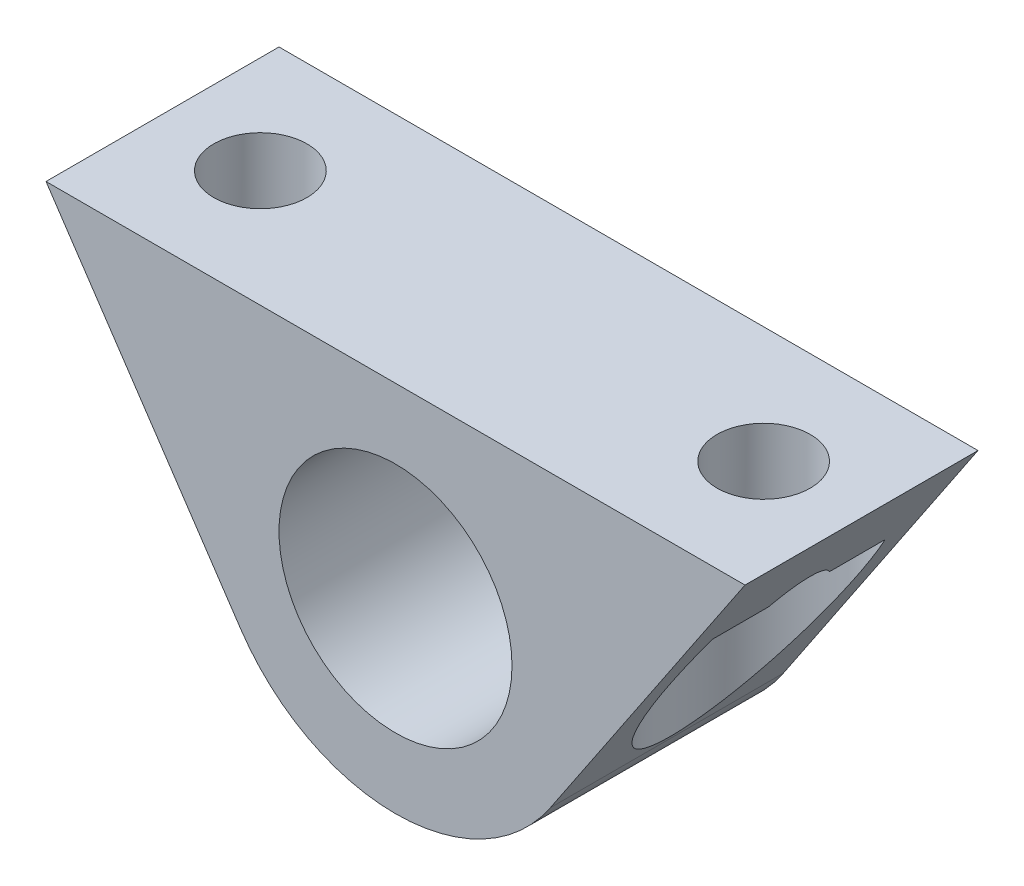
ISO-10303-21;
HEADER;
FILE_DESCRIPTION(('STEP AP214'),'2;1');
FILE_NAME('part.step','',(''),(''),'','','');
FILE_SCHEMA(('AUTOMOTIVE_DESIGN { 1 0 10303 214 1 1 1 1 }'));
ENDSEC;
DATA;
#1=APPLICATION_CONTEXT('core data for automotive mechanical design processes');
#2=APPLICATION_PROTOCOL_DEFINITION('international standard','automotive_design',2000,#1);
#3=PRODUCT_CONTEXT('',#1,'mechanical');
#4=PRODUCT('Part','Part','',(#3));
#5=PRODUCT_RELATED_PRODUCT_CATEGORY('part','',(#4));
#6=PRODUCT_DEFINITION_FORMATION('','',#4);
#7=PRODUCT_DEFINITION_CONTEXT('part definition',#1,'design');
#8=PRODUCT_DEFINITION('design','',#6,#7);
#9=PRODUCT_DEFINITION_SHAPE('','',#8);
#10=(LENGTH_UNIT() NAMED_UNIT(*) SI_UNIT(.MILLI.,.METRE.));
#11=(NAMED_UNIT(*) PLANE_ANGLE_UNIT() SI_UNIT($,.RADIAN.));
#12=(NAMED_UNIT(*) SI_UNIT($,.STERADIAN.) SOLID_ANGLE_UNIT());
#13=UNCERTAINTY_MEASURE_WITH_UNIT(LENGTH_MEASURE(1.E-05),#10,'distance_accuracy_value','');
#14=(GEOMETRIC_REPRESENTATION_CONTEXT(3) GLOBAL_UNCERTAINTY_ASSIGNED_CONTEXT((#13)) GLOBAL_UNIT_ASSIGNED_CONTEXT((#10,
#11,#12)) REPRESENTATION_CONTEXT('',''));
#15=CARTESIAN_POINT('',(0.,0.,0.));
#16=DIRECTION('',(0.,0.,1.));
#17=DIRECTION('',(1.,0.,0.));
#18=AXIS2_PLACEMENT_3D('',#15,#16,#17);
#19=CARTESIAN_POINT('',(0.,0.,5.));
#20=DIRECTION('',(0.,0.,1.));
#21=DIRECTION('',(1.,0.,0.));
#22=AXIS2_PLACEMENT_3D('',#19,#20,#21);
#23=PLANE('',#22);
#24=DIRECTION('',(0.557093425605536,-0.830449826989619,0.));
#25=VECTOR('',#24,1.);
#26=CARTESIAN_POINT('',(-7.5,4.,5.));
#27=LINE('',#26,#25);
#28=CARTESIAN_POINT('',(-7.5,4.,5.));
#29=VERTEX_POINT('',#28);
#30=CARTESIAN_POINT('',(-3.32179930795848,-2.22837370242214,5.));
#31=VERTEX_POINT('',#30);
#32=EDGE_CURVE('E145',#29,#31,#27,.T.);
#33=ORIENTED_EDGE('',*,*,#32,.T.);
#34=CARTESIAN_POINT('',(0.,0.,5.));
#35=DIRECTION('',(0.,0.,1.));
#36=DIRECTION('',(1.,0.,0.));
#37=AXIS2_PLACEMENT_3D('',#34,#35,#36);
#38=CIRCLE('',#37,4.);
#39=CARTESIAN_POINT('',(3.32179930795848,-2.22837370242214,5.));
#40=VERTEX_POINT('',#39);
#41=EDGE_CURVE('E82',#31,#40,#38,.T.);
#42=ORIENTED_EDGE('',*,*,#41,.T.);
#43=DIRECTION('',(0.557093425605536,0.830449826989619,0.));
#44=VECTOR('',#43,1.);
#45=CARTESIAN_POINT('',(7.5,4.,5.));
#46=LINE('',#45,#44);
#47=CARTESIAN_POINT('',(7.5,4.,5.));
#48=VERTEX_POINT('',#47);
#49=EDGE_CURVE('E154',#40,#48,#46,.T.);
#50=ORIENTED_EDGE('',*,*,#49,.T.);
#51=DIRECTION('',(-1.,0.,0.));
#52=VECTOR('',#51,1.);
#53=CARTESIAN_POINT('',(-7.5,4.,5.));
#54=LINE('',#53,#52);
#55=EDGE_CURVE('E50',#48,#29,#54,.T.);
#56=ORIENTED_EDGE('',*,*,#55,.T.);
#57=EDGE_LOOP('',(#33,#42,#50,#56));
#58=FACE_BOUND('',#57,.T.);
#59=CARTESIAN_POINT('',(0.,0.,5.));
#60=DIRECTION('',(0.,0.,1.));
#61=DIRECTION('',(1.,0.,0.));
#62=AXIS2_PLACEMENT_3D('',#59,#60,#61);
#63=CIRCLE('',#62,2.5);
#64=CARTESIAN_POINT('',(2.5,0.,5.));
#65=VERTEX_POINT('',#64);
#66=EDGE_CURVE('E152',#65,#65,#63,.T.);
#67=ORIENTED_EDGE('',*,*,#66,.F.);
#68=EDGE_LOOP('',(#67));
#69=FACE_BOUND('',#68,.T.);
#70=ADVANCED_FACE('F33',(#58,#69),#23,.T.);
#71=CARTESIAN_POINT('',(0.,0.,0.));
#72=DIRECTION('',(0.,0.,1.));
#73=DIRECTION('',(1.,0.,0.));
#74=AXIS2_PLACEMENT_3D('',#71,#72,#73);
#75=PLANE('',#74);
#76=DIRECTION('',(0.557093425605536,-0.830449826989619,0.));
#77=VECTOR('',#76,1.);
#78=CARTESIAN_POINT('',(-7.5,4.,0.));
#79=LINE('',#78,#77);
#80=CARTESIAN_POINT('',(-7.5,4.,0.));
#81=VERTEX_POINT('',#80);
#82=CARTESIAN_POINT('',(-3.32179930795848,-2.22837370242214,0.));
#83=VERTEX_POINT('',#82);
#84=EDGE_CURVE('E149',#81,#83,#79,.T.);
#85=ORIENTED_EDGE('',*,*,#84,.F.);
#86=DIRECTION('',(-1.,0.,0.));
#87=VECTOR('',#86,1.);
#88=CARTESIAN_POINT('',(-7.5,4.,0.));
#89=LINE('',#88,#87);
#90=CARTESIAN_POINT('',(7.5,4.,0.));
#91=VERTEX_POINT('',#90);
#92=EDGE_CURVE('E74',#91,#81,#89,.T.);
#93=ORIENTED_EDGE('',*,*,#92,.F.);
#94=DIRECTION('',(0.557093425605536,0.830449826989619,0.));
#95=VECTOR('',#94,1.);
#96=CARTESIAN_POINT('',(7.5,4.,0.));
#97=LINE('',#96,#95);
#98=CARTESIAN_POINT('',(3.32179930795848,-2.22837370242214,0.));
#99=VERTEX_POINT('',#98);
#100=EDGE_CURVE('E68',#99,#91,#97,.T.);
#101=ORIENTED_EDGE('',*,*,#100,.F.);
#102=CARTESIAN_POINT('',(0.,0.,0.));
#103=DIRECTION('',(0.,0.,1.));
#104=DIRECTION('',(1.,0.,0.));
#105=AXIS2_PLACEMENT_3D('',#102,#103,#104);
#106=CIRCLE('',#105,4.);
#107=EDGE_CURVE('E147',#83,#99,#106,.T.);
#108=ORIENTED_EDGE('',*,*,#107,.F.);
#109=EDGE_LOOP('',(#85,#93,#101,#108));
#110=FACE_BOUND('',#109,.T.);
#111=CARTESIAN_POINT('',(0.,0.,0.));
#112=DIRECTION('',(0.,0.,1.));
#113=DIRECTION('',(1.,0.,0.));
#114=AXIS2_PLACEMENT_3D('',#111,#112,#113);
#115=CIRCLE('',#114,2.5);
#116=CARTESIAN_POINT('',(2.5,0.,0.));
#117=VERTEX_POINT('',#116);
#118=EDGE_CURVE('E158',#117,#117,#115,.T.);
#119=ORIENTED_EDGE('',*,*,#118,.T.);
#120=EDGE_LOOP('',(#119));
#121=FACE_BOUND('',#120,.T.);
#122=ADVANCED_FACE('F209',(#110,#121),#75,.F.);
#123=CARTESIAN_POINT('',(-7.5,4.,5.));
#124=DIRECTION('',(0.830449826989619,0.557093425605536,0.));
#125=DIRECTION('',(-0.557093425605536,0.830449826989619,0.));
#126=AXIS2_PLACEMENT_3D('',#123,#124,#125);
#127=PLANE('',#126);
#128=DIRECTION('',(0.,0.,1.));
#129=VECTOR('',#128,1.);
#130=CARTESIAN_POINT('',(-6.15833333333333,2.,5.));
#131=LINE('',#130,#129);
#132=CARTESIAN_POINT('',(-6.15833333333333,2.,0.649343209680531));
#133=VERTEX_POINT('',#132);
#134=CARTESIAN_POINT('',(-6.15833333333333,2.,1.84813302311318));
#135=VERTEX_POINT('',#134);
#136=EDGE_CURVE('E42',#133,#135,#131,.T.);
#137=ORIENTED_EDGE('',*,*,#136,.T.);
#138=CARTESIAN_POINT('',(-5.4,0.869565217391309,2.5));
#139=DIRECTION('',(0.830449826989619,0.557093425605536,0.));
#140=DIRECTION('',(-0.557093425605536,0.830449826989619,0.));
#141=AXIS2_PLACEMENT_3D('',#138,#139,#140);
#142=ELLIPSE('',#141,1.79503105590062,1.);
#143=CARTESIAN_POINT('',(-6.15833333333333,2.,3.15186697688682));
#144=VERTEX_POINT('',#143);
#145=EDGE_CURVE('E111',#135,#144,#142,.T.);
#146=ORIENTED_EDGE('',*,*,#145,.T.);
#147=CARTESIAN_POINT('',(-6.15833333333333,2.,4.35065679031947));
#148=VERTEX_POINT('',#147);
#149=EDGE_CURVE('E121',#144,#148,#131,.T.);
#150=ORIENTED_EDGE('',*,*,#149,.T.);
#151=CARTESIAN_POINT('',(-5.4,0.869565217391308,2.5));
#152=DIRECTION('',(0.830449826989619,0.557093425605536,0.));
#153=DIRECTION('',(-0.557093425605536,0.830449826989619,0.));
#154=AXIS2_PLACEMENT_3D('',#151,#152,#153);
#155=ELLIPSE('',#154,3.59006211180124,2.);
#156=EDGE_CURVE('E11',#148,#133,#155,.T.);
#157=ORIENTED_EDGE('',*,*,#156,.T.);
#158=EDGE_LOOP('',(#137,#146,#150,#157));
#159=FACE_BOUND('',#158,.T.);
#160=ORIENTED_EDGE('',*,*,#84,.T.);
#161=DIRECTION('',(0.,0.,-1.));
#162=VECTOR('',#161,1.);
#163=CARTESIAN_POINT('',(-3.32179930795848,-2.22837370242214,5.));
#164=LINE('',#163,#162);
#165=EDGE_CURVE('E136',#31,#83,#164,.T.);
#166=ORIENTED_EDGE('',*,*,#165,.F.);
#167=ORIENTED_EDGE('',*,*,#32,.F.);
#168=DIRECTION('',(0.,0.,-1.));
#169=VECTOR('',#168,1.);
#170=CARTESIAN_POINT('',(-7.5,4.,5.));
#171=LINE('',#170,#169);
#172=EDGE_CURVE('E142',#29,#81,#171,.T.);
#173=ORIENTED_EDGE('',*,*,#172,.T.);
#174=EDGE_LOOP('',(#160,#166,#167,#173));
#175=FACE_BOUND('',#174,.T.);
#176=ADVANCED_FACE('F35',(#159,#175),#127,.F.);
#177=CARTESIAN_POINT('',(0.,0.,5.));
#178=DIRECTION('',(0.,0.,-1.));
#179=DIRECTION('',(-1.,0.,0.));
#180=AXIS2_PLACEMENT_3D('',#177,#178,#179);
#181=CYLINDRICAL_SURFACE('',#180,4.);
#182=ORIENTED_EDGE('',*,*,#107,.T.);
#183=DIRECTION('',(0.,0.,-1.));
#184=VECTOR('',#183,1.);
#185=CARTESIAN_POINT('',(3.32179930795848,-2.22837370242214,5.));
#186=LINE('',#185,#184);
#187=EDGE_CURVE('E138',#40,#99,#186,.T.);
#188=ORIENTED_EDGE('',*,*,#187,.F.);
#189=ORIENTED_EDGE('',*,*,#41,.F.);
#190=ORIENTED_EDGE('',*,*,#165,.T.);
#191=EDGE_LOOP('',(#182,#188,#189,#190));
#192=FACE_BOUND('',#191,.T.);
#193=ADVANCED_FACE('F219',(#192),#181,.T.);
#194=CARTESIAN_POINT('',(7.5,4.,5.));
#195=DIRECTION('',(-0.830449826989619,0.557093425605536,0.));
#196=DIRECTION('',(-0.557093425605536,-0.830449826989619,0.));
#197=AXIS2_PLACEMENT_3D('',#194,#195,#196);
#198=PLANE('',#197);
#199=DIRECTION('',(0.,0.,-1.));
#200=VECTOR('',#199,1.);
#201=CARTESIAN_POINT('',(6.15833333333333,2.,5.));
#202=LINE('',#201,#200);
#203=CARTESIAN_POINT('',(6.15833333333333,2.,4.35065679031947));
#204=VERTEX_POINT('',#203);
#205=CARTESIAN_POINT('',(6.15833333333333,2.,3.15186697688681));
#206=VERTEX_POINT('',#205);
#207=EDGE_CURVE('E130',#204,#206,#202,.T.);
#208=ORIENTED_EDGE('',*,*,#207,.T.);
#209=CARTESIAN_POINT('',(5.4,0.869565217391307,2.5));
#210=DIRECTION('',(-0.830449826989619,0.557093425605536,0.));
#211=DIRECTION('',(0.557093425605536,0.830449826989619,0.));
#212=AXIS2_PLACEMENT_3D('',#209,#210,#211);
#213=ELLIPSE('',#212,1.79503105590062,1.);
#214=CARTESIAN_POINT('',(6.15833333333333,2.,1.84813302311319));
#215=VERTEX_POINT('',#214);
#216=EDGE_CURVE('E122',#206,#215,#213,.T.);
#217=ORIENTED_EDGE('',*,*,#216,.T.);
#218=CARTESIAN_POINT('',(6.15833333333333,2.,0.649343209680532));
#219=VERTEX_POINT('',#218);
#220=EDGE_CURVE('E133',#215,#219,#202,.T.);
#221=ORIENTED_EDGE('',*,*,#220,.T.);
#222=CARTESIAN_POINT('',(5.4,0.869565217391306,2.5));
#223=DIRECTION('',(-0.830449826989619,0.557093425605536,0.));
#224=DIRECTION('',(0.557093425605536,0.830449826989619,0.));
#225=AXIS2_PLACEMENT_3D('',#222,#223,#224);
#226=ELLIPSE('',#225,3.59006211180124,2.);
#227=EDGE_CURVE('E128',#219,#204,#226,.T.);
#228=ORIENTED_EDGE('',*,*,#227,.T.);
#229=EDGE_LOOP('',(#208,#217,#221,#228));
#230=FACE_BOUND('',#229,.T.);
#231=ORIENTED_EDGE('',*,*,#100,.T.);
#232=DIRECTION('',(0.,0.,-1.));
#233=VECTOR('',#232,1.);
#234=CARTESIAN_POINT('',(7.5,4.,5.));
#235=LINE('',#234,#233);
#236=EDGE_CURVE('E140',#48,#91,#235,.T.);
#237=ORIENTED_EDGE('',*,*,#236,.F.);
#238=ORIENTED_EDGE('',*,*,#49,.F.);
#239=ORIENTED_EDGE('',*,*,#187,.T.);
#240=EDGE_LOOP('',(#231,#237,#238,#239));
#241=FACE_BOUND('',#240,.T.);
#242=ADVANCED_FACE('F182',(#230,#241),#198,.F.);
#243=CARTESIAN_POINT('',(-7.5,4.,5.));
#244=DIRECTION('',(0.,-1.,0.));
#245=DIRECTION('',(0.,0.,-1.));
#246=AXIS2_PLACEMENT_3D('',#243,#244,#245);
#247=PLANE('',#246);
#248=CARTESIAN_POINT('',(-5.4,4.,2.5));
#249=DIRECTION('',(0.,1.,0.));
#250=DIRECTION('',(0.,0.,1.));
#251=AXIS2_PLACEMENT_3D('',#248,#249,#250);
#252=CIRCLE('',#251,1.);
#253=CARTESIAN_POINT('',(-5.4,4.,3.5));
#254=VERTEX_POINT('',#253);
#255=EDGE_CURVE('E123',#254,#254,#252,.T.);
#256=ORIENTED_EDGE('',*,*,#255,.F.);
#257=EDGE_LOOP('',(#256));
#258=FACE_BOUND('',#257,.T.);
#259=CARTESIAN_POINT('',(5.4,4.,2.5));
#260=DIRECTION('',(0.,1.,0.));
#261=DIRECTION('',(0.,0.,1.));
#262=AXIS2_PLACEMENT_3D('',#259,#260,#261);
#263=CIRCLE('',#262,1.);
#264=CARTESIAN_POINT('',(5.4,4.,3.5));
#265=VERTEX_POINT('',#264);
#266=EDGE_CURVE('E171',#265,#265,#263,.T.);
#267=ORIENTED_EDGE('',*,*,#266,.F.);
#268=EDGE_LOOP('',(#267));
#269=FACE_BOUND('',#268,.T.);
#270=ORIENTED_EDGE('',*,*,#92,.T.);
#271=ORIENTED_EDGE('',*,*,#172,.F.);
#272=ORIENTED_EDGE('',*,*,#55,.F.);
#273=ORIENTED_EDGE('',*,*,#236,.T.);
#274=EDGE_LOOP('',(#270,#271,#272,#273));
#275=FACE_BOUND('',#274,.T.);
#276=ADVANCED_FACE('F178',(#258,#269,#275),#247,.F.);
#277=CARTESIAN_POINT('',(0.,0.,5.));
#278=DIRECTION('',(0.,0.,-1.));
#279=DIRECTION('',(-1.,0.,0.));
#280=AXIS2_PLACEMENT_3D('',#277,#278,#279);
#281=CYLINDRICAL_SURFACE('',#280,2.5);
#282=ORIENTED_EDGE('',*,*,#66,.T.);
#283=EDGE_LOOP('',(#282));
#284=FACE_BOUND('',#283,.T.);
#285=ORIENTED_EDGE('',*,*,#118,.F.);
#286=EDGE_LOOP('',(#285));
#287=FACE_BOUND('',#286,.T.);
#288=ADVANCED_FACE('F181',(#284,#287),#281,.F.);
#289=CARTESIAN_POINT('',(5.4,-4.,2.5));
#290=DIRECTION('',(0.,1.,0.));
#291=DIRECTION('',(0.,0.,1.));
#292=AXIS2_PLACEMENT_3D('',#289,#290,#291);
#293=CYLINDRICAL_SURFACE('',#292,2.);
#294=CARTESIAN_POINT('',(5.4,2.,2.5));
#295=DIRECTION('',(0.,1.,0.));
#296=DIRECTION('',(0.,0.,1.));
#297=AXIS2_PLACEMENT_3D('',#294,#295,#296);
#298=CIRCLE('',#297,2.);
#299=EDGE_CURVE('E116',#219,#204,#298,.T.);
#300=ORIENTED_EDGE('',*,*,#299,.T.);
#301=ORIENTED_EDGE('',*,*,#227,.F.);
#302=EDGE_LOOP('',(#300,#301));
#303=FACE_BOUND('',#302,.T.);
#304=ADVANCED_FACE('F197',(#303),#293,.F.);
#305=CARTESIAN_POINT('',(5.4,2.,2.5));
#306=DIRECTION('',(0.,1.,0.));
#307=DIRECTION('',(0.,0.,1.));
#308=AXIS2_PLACEMENT_3D('',#305,#306,#307);
#309=PLANE('',#308);
#310=ORIENTED_EDGE('',*,*,#299,.F.);
#311=ORIENTED_EDGE('',*,*,#220,.F.);
#312=CARTESIAN_POINT('',(5.4,2.,2.5));
#313=DIRECTION('',(0.,1.,0.));
#314=DIRECTION('',(0.,0.,1.));
#315=AXIS2_PLACEMENT_3D('',#312,#313,#314);
#316=CIRCLE('',#315,1.);
#317=EDGE_CURVE('E165',#215,#206,#316,.T.);
#318=ORIENTED_EDGE('',*,*,#317,.T.);
#319=ORIENTED_EDGE('',*,*,#207,.F.);
#320=EDGE_LOOP('',(#310,#311,#318,#319));
#321=FACE_BOUND('',#320,.T.);
#322=ADVANCED_FACE('F195',(#321),#309,.F.);
#323=CARTESIAN_POINT('',(-5.4,-4.,2.5));
#324=DIRECTION('',(0.,1.,0.));
#325=DIRECTION('',(0.,0.,1.));
#326=AXIS2_PLACEMENT_3D('',#323,#324,#325);
#327=CYLINDRICAL_SURFACE('',#326,2.);
#328=CARTESIAN_POINT('',(-5.4,2.,2.5));
#329=DIRECTION('',(0.,1.,0.));
#330=DIRECTION('',(0.,0.,1.));
#331=AXIS2_PLACEMENT_3D('',#328,#329,#330);
#332=CIRCLE('',#331,2.);
#333=EDGE_CURVE('E115',#148,#133,#332,.T.);
#334=ORIENTED_EDGE('',*,*,#333,.T.);
#335=ORIENTED_EDGE('',*,*,#156,.F.);
#336=EDGE_LOOP('',(#334,#335));
#337=FACE_BOUND('',#336,.T.);
#338=ADVANCED_FACE('F204',(#337),#327,.F.);
#339=CARTESIAN_POINT('',(-5.4,2.,2.5));
#340=DIRECTION('',(0.,1.,0.));
#341=DIRECTION('',(0.,0.,1.));
#342=AXIS2_PLACEMENT_3D('',#339,#340,#341);
#343=PLANE('',#342);
#344=ORIENTED_EDGE('',*,*,#333,.F.);
#345=ORIENTED_EDGE('',*,*,#149,.F.);
#346=CARTESIAN_POINT('',(-5.4,2.,2.5));
#347=DIRECTION('',(0.,1.,0.));
#348=DIRECTION('',(0.,0.,1.));
#349=AXIS2_PLACEMENT_3D('',#346,#347,#348);
#350=CIRCLE('',#349,1.);
#351=EDGE_CURVE('E108',#144,#135,#350,.T.);
#352=ORIENTED_EDGE('',*,*,#351,.T.);
#353=ORIENTED_EDGE('',*,*,#136,.F.);
#354=EDGE_LOOP('',(#344,#345,#352,#353));
#355=FACE_BOUND('',#354,.T.);
#356=ADVANCED_FACE('F126',(#355),#343,.F.);
#357=CARTESIAN_POINT('',(-5.4,-4.,2.5));
#358=DIRECTION('',(0.,1.,0.));
#359=DIRECTION('',(0.,0.,1.));
#360=AXIS2_PLACEMENT_3D('',#357,#358,#359);
#361=CYLINDRICAL_SURFACE('',#360,1.);
#362=ORIENTED_EDGE('',*,*,#255,.T.);
#363=EDGE_LOOP('',(#362));
#364=FACE_BOUND('',#363,.T.);
#365=ORIENTED_EDGE('',*,*,#351,.F.);
#366=ORIENTED_EDGE('',*,*,#145,.F.);
#367=EDGE_LOOP('',(#365,#366));
#368=FACE_BOUND('',#367,.T.);
#369=ADVANCED_FACE('F110',(#364,#368),#361,.F.);
#370=CARTESIAN_POINT('',(5.4,-4.,2.5));
#371=DIRECTION('',(0.,1.,0.));
#372=DIRECTION('',(0.,0.,1.));
#373=AXIS2_PLACEMENT_3D('',#370,#371,#372);
#374=CYLINDRICAL_SURFACE('',#373,1.);
#375=ORIENTED_EDGE('',*,*,#266,.T.);
#376=EDGE_LOOP('',(#375));
#377=FACE_BOUND('',#376,.T.);
#378=ORIENTED_EDGE('',*,*,#317,.F.);
#379=ORIENTED_EDGE('',*,*,#216,.F.);
#380=EDGE_LOOP('',(#378,#379));
#381=FACE_BOUND('',#380,.T.);
#382=ADVANCED_FACE('F186',(#377,#381),#374,.F.);
#383=CLOSED_SHELL('',(#70,#122,#176,#193,#242,#276,#288,#304,#322,#338,#356,#369,#382));
#384=MANIFOLD_SOLID_BREP('B2',#383);
#385=ADVANCED_BREP_SHAPE_REPRESENTATION('',(#18,#384),#14);
#386=SHAPE_DEFINITION_REPRESENTATION(#9,#385);
ENDSEC;
END-ISO-10303-21;
